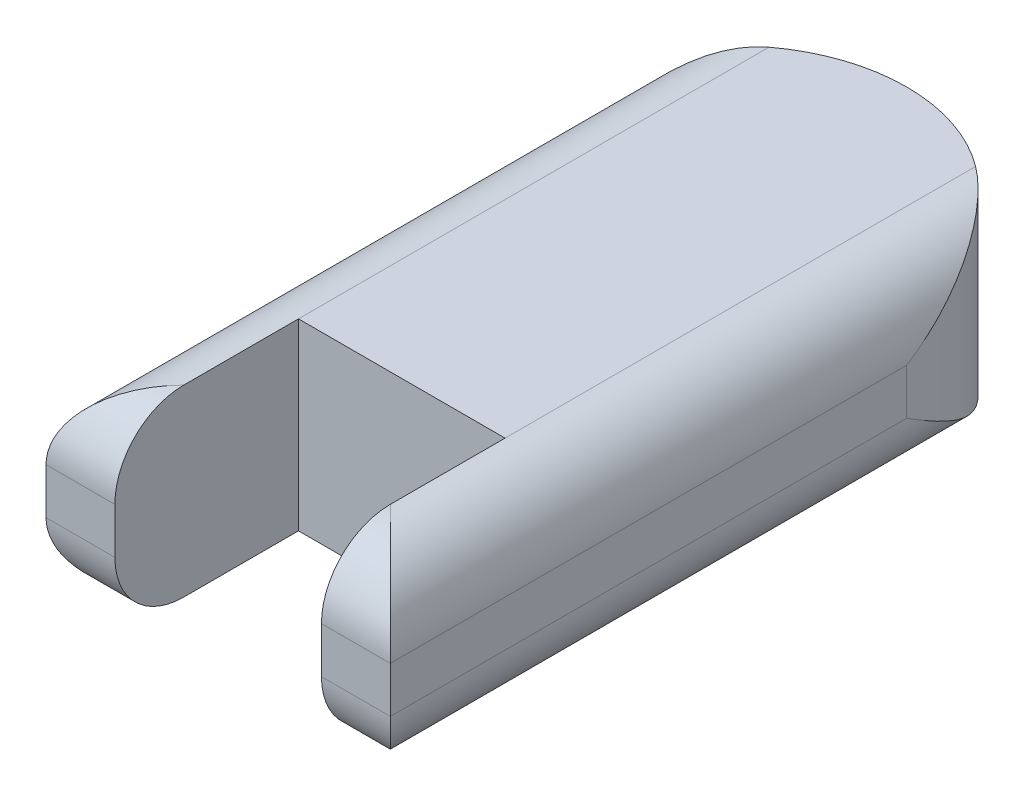
ISO-10303-21;
HEADER;
FILE_DESCRIPTION(('STEP AP214'),'2;1');
FILE_NAME('part.step','',(''),(''),'','','');
FILE_SCHEMA(('AUTOMOTIVE_DESIGN { 1 0 10303 214 1 1 1 1 }'));
ENDSEC;
DATA;
#1=APPLICATION_CONTEXT('core data for automotive mechanical design processes');
#2=APPLICATION_PROTOCOL_DEFINITION('international standard','automotive_design',2000,#1);
#3=PRODUCT_CONTEXT('',#1,'mechanical');
#4=PRODUCT('Part','Part','',(#3));
#5=PRODUCT_RELATED_PRODUCT_CATEGORY('part','',(#4));
#6=PRODUCT_DEFINITION_FORMATION('','',#4);
#7=PRODUCT_DEFINITION_CONTEXT('part definition',#1,'design');
#8=PRODUCT_DEFINITION('design','',#6,#7);
#9=PRODUCT_DEFINITION_SHAPE('','',#8);
#10=(LENGTH_UNIT() NAMED_UNIT(*) SI_UNIT(.MILLI.,.METRE.));
#11=(NAMED_UNIT(*) PLANE_ANGLE_UNIT() SI_UNIT($,.RADIAN.));
#12=(NAMED_UNIT(*) SI_UNIT($,.STERADIAN.) SOLID_ANGLE_UNIT());
#13=UNCERTAINTY_MEASURE_WITH_UNIT(LENGTH_MEASURE(1.E-05),#10,'distance_accuracy_value','');
#14=(GEOMETRIC_REPRESENTATION_CONTEXT(3) GLOBAL_UNCERTAINTY_ASSIGNED_CONTEXT((#13)) GLOBAL_UNIT_ASSIGNED_CONTEXT((#10,
#11,#12)) REPRESENTATION_CONTEXT('',''));
#15=CARTESIAN_POINT('',(0.,0.,0.));
#16=DIRECTION('',(0.,0.,1.));
#17=DIRECTION('',(1.,0.,0.));
#18=AXIS2_PLACEMENT_3D('',#15,#16,#17);
#19=CARTESIAN_POINT('',(-45.,10.,-150.));
#20=DIRECTION('',(0.,0.,1.));
#21=DIRECTION('',(1.,0.,0.));
#22=AXIS2_PLACEMENT_3D('',#19,#20,#21);
#23=CYLINDRICAL_SURFACE('',#22,30.);
#24=DIRECTION('',(0.,0.,1.));
#25=VECTOR('',#24,1.);
#26=CARTESIAN_POINT('',(-45.,40.,-150.));
#27=LINE('',#26,#25);
#28=CARTESIAN_POINT('',(-45.,40.,-135.));
#29=VERTEX_POINT('',#28);
#30=CARTESIAN_POINT('',(-45.,40.,70.));
#31=VERTEX_POINT('',#30);
#32=EDGE_CURVE('E12',#29,#31,#27,.T.);
#33=ORIENTED_EDGE('',*,*,#32,.F.);
#34=CARTESIAN_POINT('',(-45.,40.,-135.));
#35=CARTESIAN_POINT('',(-45.5129326516907,39.999996891138,-134.615322129283));
#36=CARTESIAN_POINT('',(-46.020856524783,39.9868459359491,-134.224081394058));
#37=CARTESIAN_POINT('',(-47.0256414910776,39.9357612324056,-133.429431971806));
#38=CARTESIAN_POINT('',(-47.5225051540346,39.8978333042712,-133.026026163632));
#39=CARTESIAN_POINT('',(-48.5035389933597,39.7987896540022,-132.208512261245));
#40=CARTESIAN_POINT('',(-48.9877291482159,39.737713112406,-131.79442334648));
#41=CARTESIAN_POINT('',(-49.9435913758493,39.5938258336057,-130.955715542044));
#42=CARTESIAN_POINT('',(-50.4152626575976,39.5110137265813,-130.53109599024));
#43=CARTESIAN_POINT('',(-51.8016859134143,39.2338800624589,-129.250869434586));
#44=CARTESIAN_POINT('',(-52.6974316582793,39.0098365048569,-128.380892910171));
#45=CARTESIAN_POINT('',(-54.4350421063243,38.4921490548422,-126.607835373252));
#46=CARTESIAN_POINT('',(-55.2768748642796,38.19846437362,-125.70473522327));
#47=CARTESIAN_POINT('',(-56.6705634529918,37.6439350839685,-124.134612469589));
#48=CARTESIAN_POINT('',(-57.2361608692018,37.3979546830271,-123.474428694605));
#49=CARTESIAN_POINT('',(-58.3389889750294,36.8782989685193,-122.141389758637));
#50=CARTESIAN_POINT('',(-58.8762195091685,36.6046235031806,-121.468534528228));
#51=CARTESIAN_POINT('',(-59.922423392937,36.0322282933504,-120.111389279961));
#52=CARTESIAN_POINT('',(-60.4313908181932,35.7335033308,-119.42709690352));
#53=CARTESIAN_POINT('',(-61.4210781644571,35.1135243081027,-118.048475702944));
#54=CARTESIAN_POINT('',(-61.901798662266,34.7922707082838,-117.354147084111));
#55=CARTESIAN_POINT('',(-63.3072892909294,33.794308017369,-115.249763563041));
#56=CARTESIAN_POINT('',(-64.1896307642946,33.0865981105108,-113.825808096373));
#57=CARTESIAN_POINT('',(-65.8438741364267,31.6047711387151,-110.94910483094));
#58=CARTESIAN_POINT('',(-66.6157739551916,30.8306528235147,-109.496356490491));
#59=CARTESIAN_POINT('',(-67.8421382905647,29.4631851013754,-106.996483241003));
#60=CARTESIAN_POINT('',(-68.3233984919259,28.8832183958558,-105.955049175923));
#61=CARTESIAN_POINT('',(-69.2334515246382,27.7001933711408,-103.862281201929));
#62=CARTESIAN_POINT('',(-69.6622399291931,27.0971331092789,-102.810946465788));
#63=CARTESIAN_POINT('',(-70.4684953636039,25.8711755990845,-100.699585455916));
#64=CARTESIAN_POINT('',(-70.8459405322702,25.2482700393712,-99.6395556823799));
#65=CARTESIAN_POINT('',(-71.5502414414883,23.9859584363945,-97.5126166885381));
#66=CARTESIAN_POINT('',(-71.8770985989791,23.3465528558722,-96.4457076617885));
#67=CARTESIAN_POINT('',(-72.4804787884683,22.0552931936701,-94.308308779173));
#68=CARTESIAN_POINT('',(-72.7571017851753,21.4034667515651,-93.2378304494445));
#69=CARTESIAN_POINT('',(-73.2615322228068,20.0886863253276,-91.0923096966063));
#70=CARTESIAN_POINT('',(-73.4893385656805,19.4257320912552,-90.0172671713869));
#71=CARTESIAN_POINT('',(-74.1002456614274,17.424362182841,-86.7878268803705));
#72=CARTESIAN_POINT('',(-74.4112733763674,16.0724890807064,-84.6275521623039));
#73=CARTESIAN_POINT('',(-74.7511970559847,13.9350877538937,-81.2289210221354));
#74=CARTESIAN_POINT('',(-74.8438863335703,13.1554227009019,-79.9926800811043));
#75=CARTESIAN_POINT('',(-74.9678777696519,11.5935640710989,-77.5196655898393));
#76=CARTESIAN_POINT('',(-74.999222496609,10.8113726252135,-76.2828930050376));
#77=CARTESIAN_POINT('',(-74.9999952377403,10.0195179844808,-75.0308606435064));
#78=CARTESIAN_POINT('',(-74.9999999996146,10.0097589831981,-75.0154303076325));
#79=CARTESIAN_POINT('',(-75.,10.,-75.));
#80=B_SPLINE_CURVE_WITH_KNOTS('',3,(#34,#35,#36,#37,#38,#39,#40,#41,#42,#43,#44,#45,#46,#47,#48,
#49,#50,#51,#52,#53,#54,#55,#56,#57,#58,#59,#60,#61,#62,#63,#64,#65,#66,#67,#68,#69,#70,#71,#72,
#73,#74,#75,#76,#77,#78,#79),.UNSPECIFIED.,.F.,.F.,(4,2,2,2,2,2,2,2,2,2,2,2,2,2,2,2,2,2,2,2,2,2,
4),(0.,1.92316776941375,3.84588394060285,5.76536021797109,7.68495749376332,11.4866856114628,
15.2906459253943,18.0001052576753,20.7095794389195,23.4196194393336,26.1296040815683,
31.5794259047891,37.0293503536748,40.8846323096262,44.7402392935013,48.597482833222,
52.4546183143664,56.3039920103971,60.1534522827089,67.8467408499336,72.2392840195837,
76.6287780154634,76.6835502730769),.UNSPECIFIED.);
#81=CARTESIAN_POINT('',(-75.,10.,-75.));
#82=VERTEX_POINT('',#81);
#83=EDGE_CURVE('E194',#29,#82,#80,.T.);
#84=ORIENTED_EDGE('',*,*,#83,.T.);
#85=DIRECTION('',(0.,0.,1.));
#86=VECTOR('',#85,1.);
#87=CARTESIAN_POINT('',(-75.,10.,-150.));
#88=LINE('',#87,#86);
#89=CARTESIAN_POINT('',(-75.,10.,150.));
#90=VERTEX_POINT('',#89);
#91=EDGE_CURVE('E44',#82,#90,#88,.T.);
#92=ORIENTED_EDGE('',*,*,#91,.T.);
#93=CARTESIAN_POINT('',(-45.,10.,120.));
#94=DIRECTION('',(0.707106781186547,0.,0.707106781186547));
#95=DIRECTION('',(-0.707106781186547,0.,0.707106781186547));
#96=AXIS2_PLACEMENT_3D('',#93,#94,#95);
#97=ELLIPSE('',#96,42.4264068711928,30.);
#98=CARTESIAN_POINT('',(-45.,40.,120.));
#99=VERTEX_POINT('',#98);
#100=EDGE_CURVE('E225',#90,#99,#97,.F.);
#101=ORIENTED_EDGE('',*,*,#100,.T.);
#102=DIRECTION('',(0.,0.,1.));
#103=VECTOR('',#102,1.);
#104=CARTESIAN_POINT('',(-45.,40.,-150.));
#105=LINE('',#104,#103);
#106=EDGE_CURVE('E193',#31,#99,#105,.T.);
#107=ORIENTED_EDGE('',*,*,#106,.F.);
#108=EDGE_LOOP('',(#33,#84,#92,#101,#107));
#109=FACE_BOUND('',#108,.T.);
#110=ADVANCED_FACE('F40',(#109),#23,.T.);
#111=CARTESIAN_POINT('',(-45.,40.,-150.));
#112=DIRECTION('',(0.,1.,0.));
#113=DIRECTION('',(0.,0.,1.));
#114=AXIS2_PLACEMENT_3D('',#111,#112,#113);
#115=PLANE('',#114);
#116=DIRECTION('',(0.,0.,1.));
#117=VECTOR('',#116,1.);
#118=CARTESIAN_POINT('',(45.,40.,-150.));
#119=LINE('',#118,#117);
#120=CARTESIAN_POINT('',(45.,40.,-135.));
#121=VERTEX_POINT('',#120);
#122=CARTESIAN_POINT('',(45.,40.,70.));
#123=VERTEX_POINT('',#122);
#124=EDGE_CURVE('E49',#121,#123,#119,.T.);
#125=ORIENTED_EDGE('',*,*,#124,.F.);
#126=CARTESIAN_POINT('',(0.,40.,-75.));
#127=DIRECTION('',(0.,1.,0.));
#128=DIRECTION('',(0.,0.,-1.));
#129=AXIS2_PLACEMENT_3D('',#126,#127,#128);
#130=CIRCLE('',#129,75.);
#131=EDGE_CURVE('E290',#121,#29,#130,.T.);
#132=ORIENTED_EDGE('',*,*,#131,.T.);
#133=ORIENTED_EDGE('',*,*,#32,.T.);
#134=DIRECTION('',(1.,0.,0.));
#135=VECTOR('',#134,1.);
#136=CARTESIAN_POINT('',(-44.9999999999998,40.,70.));
#137=LINE('',#136,#135);
#138=EDGE_CURVE('E200',#31,#123,#137,.T.);
#139=ORIENTED_EDGE('',*,*,#138,.T.);
#140=EDGE_LOOP('',(#125,#132,#133,#139));
#141=FACE_BOUND('',#140,.T.);
#142=ADVANCED_FACE('F207',(#141),#115,.T.);
#143=CARTESIAN_POINT('',(45.,10.,-150.));
#144=DIRECTION('',(0.,0.,1.));
#145=DIRECTION('',(1.,0.,0.));
#146=AXIS2_PLACEMENT_3D('',#143,#144,#145);
#147=CYLINDRICAL_SURFACE('',#146,30.);
#148=DIRECTION('',(0.,0.,1.));
#149=VECTOR('',#148,1.);
#150=CARTESIAN_POINT('',(75.,10.,-150.));
#151=LINE('',#150,#149);
#152=CARTESIAN_POINT('',(75.,10.,-75.));
#153=VERTEX_POINT('',#152);
#154=CARTESIAN_POINT('',(75.,10.,150.));
#155=VERTEX_POINT('',#154);
#156=EDGE_CURVE('E150',#153,#155,#151,.T.);
#157=ORIENTED_EDGE('',*,*,#156,.F.);
#158=CARTESIAN_POINT('',(45.,40.,-135.));
#159=CARTESIAN_POINT('',(45.5129326516886,39.999996891138,-134.615322129284));
#160=CARTESIAN_POINT('',(46.0208565247789,39.9868459359492,-134.224081394061));
#161=CARTESIAN_POINT('',(47.0256414910695,39.9357612324061,-133.429431971813));
#162=CARTESIAN_POINT('',(47.5225051540246,39.897833304272,-133.02602616364));
#163=CARTESIAN_POINT('',(48.5035389933459,39.7987896540038,-132.208512261257));
#164=CARTESIAN_POINT('',(48.9877291482002,39.7377131124081,-131.794423346493));
#165=CARTESIAN_POINT('',(49.9435913758301,39.5938258336089,-130.955715542061));
#166=CARTESIAN_POINT('',(50.4152626575767,39.5110137265852,-130.531095990259));
#167=CARTESIAN_POINT('',(51.8016859133959,39.2338800624633,-129.250869434603));
#168=CARTESIAN_POINT('',(52.6974316582649,39.0098365048608,-128.380892910186));
#169=CARTESIAN_POINT('',(54.4350421063175,38.4921490548446,-126.60783537326));
#170=CARTESIAN_POINT('',(55.2768748642764,38.1984643736213,-125.704735223274));
#171=CARTESIAN_POINT('',(56.6705634529931,37.643935083968,-124.134612469587));
#172=CARTESIAN_POINT('',(57.2361608692044,37.3979546830261,-123.474428694602));
#173=CARTESIAN_POINT('',(58.3389889750343,36.8782989685169,-122.141389758631));
#174=CARTESIAN_POINT('',(58.8762195091745,36.6046235031775,-121.46853452822));
#175=CARTESIAN_POINT('',(59.9224233929451,36.0322282933458,-120.11138927995));
#176=CARTESIAN_POINT('',(60.4313908182024,35.7335033307946,-119.427096903507));
#177=CARTESIAN_POINT('',(61.4210781644681,35.1135243080955,-118.048475702929));
#178=CARTESIAN_POINT('',(61.901798662278,34.7922707082758,-117.354147084094));
#179=CARTESIAN_POINT('',(63.3072892909396,33.7943080173611,-115.249763563025));
#180=CARTESIAN_POINT('',(64.1896307643025,33.0865981105041,-113.82580809636));
#181=CARTESIAN_POINT('',(65.8438741364303,31.6047711387115,-110.949104830933));
#182=CARTESIAN_POINT('',(66.6157739551933,30.8306528235128,-109.496356490488));
#183=CARTESIAN_POINT('',(67.8421382905638,29.4631851013765,-106.996483241004));
#184=CARTESIAN_POINT('',(68.3233984919241,28.8832183958579,-105.955049175927));
#185=CARTESIAN_POINT('',(69.233451524635,27.7001933711451,-103.862281201936));
#186=CARTESIAN_POINT('',(69.6622399291892,27.0971331092844,-102.810946465798));
#187=CARTESIAN_POINT('',(70.4684953635992,25.8711755990922,-100.699585455929));
#188=CARTESIAN_POINT('',(70.8459405322652,25.2482700393799,-99.6395556823941));
#189=CARTESIAN_POINT('',(71.5502414414828,23.9859584364047,-97.5126166885556));
#190=CARTESIAN_POINT('',(71.8770985989734,23.3465528558827,-96.445707661808));
#191=CARTESIAN_POINT('',(72.4804787884634,22.0552931936824,-94.308308779191));
#192=CARTESIAN_POINT('',(72.7571017851711,21.4034667515786,-93.2378304494593));
#193=CARTESIAN_POINT('',(73.261532222804,20.0886863253325,-91.0923096966212));
#194=CARTESIAN_POINT('',(73.4893385656784,19.4257320912502,-90.0172671714053));
#195=CARTESIAN_POINT('',(74.1002456614265,17.4243621828687,-86.7878268803613));
#196=CARTESIAN_POINT('',(74.411273376367,16.0724890808381,-84.6275521622246));
#197=CARTESIAN_POINT('',(74.7511970559848,13.9350877538197,-81.2289210221818));
#198=CARTESIAN_POINT('',(74.8438863335705,13.155422700677,-79.9926800812459));
#199=CARTESIAN_POINT('',(74.9678777696517,11.5935640713239,-77.5196655896964));
#200=CARTESIAN_POINT('',(74.9992224966083,10.8113726260387,-76.2828930045154));
#201=CARTESIAN_POINT('',(74.9999952377403,10.0195179845012,-75.0308606434934));
#202=CARTESIAN_POINT('',(74.9999999996146,10.0097589832084,-75.0154303076259));
#203=CARTESIAN_POINT('',(75.,10.,-75.));
#204=B_SPLINE_CURVE_WITH_KNOTS('',3,(#158,#159,#160,#161,#162,#163,#164,#165,#166,#167,#168,
#169,#170,#171,#172,#173,#174,#175,#176,#177,#178,#179,#180,#181,#182,#183,#184,#185,#186,#187,
#188,#189,#190,#191,#192,#193,#194,#195,#196,#197,#198,#199,#200,#201,#202,#203),.UNSPECIFIED.,
.F.,.F.,(4,2,2,2,2,2,2,2,2,2,2,2,2,2,2,2,2,2,2,2,2,2,4),(0.,1.92316776940592,3.84588394058717,
5.76536021794771,7.68495749373223,11.4866856114473,15.2906459253943,18.0001052576813,
20.7095794389316,23.419619439352,26.129604081593,31.5794259048021,37.0293503536748,
40.8846323096192,44.7402392934873,48.5974828332028,52.4546183143417,56.3039920103792,
60.1534522826983,67.8467408499337,72.2392840195843,76.6287780154634,76.6835502730768),.UNSPECIFIED.);
#205=EDGE_CURVE('E135',#153,#121,#204,.F.);
#206=ORIENTED_EDGE('',*,*,#205,.T.);
#207=ORIENTED_EDGE('',*,*,#124,.T.);
#208=DIRECTION('',(0.,0.,1.));
#209=VECTOR('',#208,1.);
#210=CARTESIAN_POINT('',(45.,40.,-150.));
#211=LINE('',#210,#209);
#212=CARTESIAN_POINT('',(45.,40.,120.));
#213=VERTEX_POINT('',#212);
#214=EDGE_CURVE('E181',#123,#213,#211,.T.);
#215=ORIENTED_EDGE('',*,*,#214,.T.);
#216=CARTESIAN_POINT('',(45.,10.,120.));
#217=DIRECTION('',(-0.707106781186547,0.,0.707106781186547));
#218=DIRECTION('',(0.707106781186547,0.,0.707106781186547));
#219=AXIS2_PLACEMENT_3D('',#216,#217,#218);
#220=ELLIPSE('',#219,42.4264068711928,30.);
#221=EDGE_CURVE('E219',#213,#155,#220,.F.);
#222=ORIENTED_EDGE('',*,*,#221,.T.);
#223=EDGE_LOOP('',(#157,#206,#207,#215,#222));
#224=FACE_BOUND('',#223,.T.);
#225=ADVANCED_FACE('F179',(#224),#147,.T.);
#226=CARTESIAN_POINT('',(45.,-10.,-150.));
#227=DIRECTION('',(0.,0.,1.));
#228=DIRECTION('',(1.,0.,0.));
#229=AXIS2_PLACEMENT_3D('',#226,#227,#228);
#230=CYLINDRICAL_SURFACE('',#229,30.);
#231=DIRECTION('',(0.,0.,1.));
#232=VECTOR('',#231,1.);
#233=CARTESIAN_POINT('',(45.,-40.,-150.));
#234=LINE('',#233,#232);
#235=CARTESIAN_POINT('',(45.,-40.,-135.));
#236=VERTEX_POINT('',#235);
#237=CARTESIAN_POINT('',(45.,-40.,70.));
#238=VERTEX_POINT('',#237);
#239=EDGE_CURVE('E144',#236,#238,#234,.T.);
#240=ORIENTED_EDGE('',*,*,#239,.F.);
#241=CARTESIAN_POINT('',(45.,-40.,-135.));
#242=CARTESIAN_POINT('',(45.5129326516883,-39.999996891138,-134.615322129285));
#243=CARTESIAN_POINT('',(46.0208565247782,-39.9868459359492,-134.224081394061));
#244=CARTESIAN_POINT('',(47.0256414910682,-39.9357612324062,-133.429431971814));
#245=CARTESIAN_POINT('',(47.522505154023,-39.8978333042722,-133.026026163641));
#246=CARTESIAN_POINT('',(48.5035389933438,-39.798789654004,-132.208512261259));
#247=CARTESIAN_POINT('',(48.9877291481979,-39.7377131124084,-131.794423346495));
#248=CARTESIAN_POINT('',(49.9435913758272,-39.5938258336094,-130.955715542064));
#249=CARTESIAN_POINT('',(50.4152626575735,-39.5110137265857,-130.531095990262));
#250=CARTESIAN_POINT('',(51.8016859133932,-39.233880062464,-129.250869434606));
#251=CARTESIAN_POINT('',(52.6974316582627,-39.0098365048614,-128.380892910188));
#252=CARTESIAN_POINT('',(54.4350421063165,-38.492149054845,-126.607835373261));
#253=CARTESIAN_POINT('',(55.2768748642758,-38.1984643736215,-125.704735223275));
#254=CARTESIAN_POINT('',(56.6705634529933,-37.6439350839679,-124.134612469587));
#255=CARTESIAN_POINT('',(57.2361608692047,-37.3979546830259,-123.474428694601));
#256=CARTESIAN_POINT('',(58.338988975035,-36.8782989685166,-122.14138975863));
#257=CARTESIAN_POINT('',(58.8762195091754,-36.6046235031771,-121.468534528219));
#258=CARTESIAN_POINT('',(59.9224233929463,-36.0322282933451,-120.111389279948));
#259=CARTESIAN_POINT('',(60.4313908182037,-35.7335033307938,-119.427096903505));
#260=CARTESIAN_POINT('',(61.4210781644698,-35.1135243080944,-118.048475702926));
#261=CARTESIAN_POINT('',(61.9017986622797,-34.7922707082745,-117.354147084091));
#262=CARTESIAN_POINT('',(63.3072892909411,-33.7943080173598,-115.249763563023));
#263=CARTESIAN_POINT('',(64.1896307643037,-33.086598110503,-113.825808096358));
#264=CARTESIAN_POINT('',(65.8438741364309,-31.6047711387109,-110.949104830932));
#265=CARTESIAN_POINT('',(66.6157739551936,-30.8306528235125,-109.496356490487));
#266=CARTESIAN_POINT('',(67.8421382905636,-29.4631851013766,-106.996483241005));
#267=CARTESIAN_POINT('',(68.3233984919238,-28.8832183958583,-105.955049175927));
#268=CARTESIAN_POINT('',(69.2334515246345,-27.7001933711458,-103.862281201937));
#269=CARTESIAN_POINT('',(69.6622399291886,-27.0971331092853,-102.810946465799));
#270=CARTESIAN_POINT('',(70.4684953635984,-25.8711755990934,-100.699585455931));
#271=CARTESIAN_POINT('',(70.8459405322644,-25.2482700393813,-99.6395556823963));
#272=CARTESIAN_POINT('',(71.5502414414819,-23.9859584364063,-97.5126166885583));
#273=CARTESIAN_POINT('',(71.8770985989725,-23.3465528558844,-96.445707661811));
#274=CARTESIAN_POINT('',(72.4804787884626,-22.0552931936842,-94.3083087791939));
#275=CARTESIAN_POINT('',(72.7571017851705,-21.4034667515807,-93.2378304494616));
#276=CARTESIAN_POINT('',(73.2615322228035,-20.0886863253333,-91.0923096966235));
#277=CARTESIAN_POINT('',(73.489338565678,-19.4257320912495,-90.0172671714081));
#278=CARTESIAN_POINT('',(74.1002456614264,-17.4243621828727,-86.78782688036));
#279=CARTESIAN_POINT('',(74.411273376367,-16.0724890808575,-84.627552162213));
#280=CARTESIAN_POINT('',(74.7511970559848,-13.9350877538087,-81.2289210221887));
#281=CARTESIAN_POINT('',(74.8438863335704,-13.1554227006437,-79.9926800812669));
#282=CARTESIAN_POINT('',(74.9678777696518,-11.5935640713573,-77.5196655896753));
#283=CARTESIAN_POINT('',(74.9992224966087,-10.811372626161,-76.282893004438));
#284=CARTESIAN_POINT('',(74.9999952377403,-10.0195179845043,-75.0308606434915));
#285=CARTESIAN_POINT('',(74.9999999996146,-10.00975898321,-75.015430307625));
#286=CARTESIAN_POINT('',(75.,-10.,-75.));
#287=B_SPLINE_CURVE_WITH_KNOTS('',3,(#241,#242,#243,#244,#245,#246,#247,#248,#249,#250,#251,
#252,#253,#254,#255,#256,#257,#258,#259,#260,#261,#262,#263,#264,#265,#266,#267,#268,#269,#270,
#271,#272,#273,#274,#275,#276,#277,#278,#279,#280,#281,#282,#283,#284,#285,#286),.UNSPECIFIED.,
.F.,.F.,(4,2,2,2,2,2,2,2,2,2,2,2,2,2,2,2,2,2,2,2,2,2,4),(0.,1.92316776940472,3.84588394058478,
5.76536021794419,7.68495749372755,11.486685611445,15.2906459253942,18.0001052576822,
20.7095794389334,23.4196194393547,26.1296040815966,31.579425904804,37.0293503536747,
40.884632309618,44.7402392934851,48.5974828331998,52.4546183143379,56.3039920103763,
60.1534522826966,67.8467408499337,72.2392840195844,76.6287780154633,76.6835502730768),.UNSPECIFIED.);
#288=CARTESIAN_POINT('',(75.,-10.,-75.));
#289=VERTEX_POINT('',#288);
#290=EDGE_CURVE('E132',#236,#289,#287,.T.);
#291=ORIENTED_EDGE('',*,*,#290,.T.);
#292=DIRECTION('',(0.,0.,1.));
#293=VECTOR('',#292,1.);
#294=CARTESIAN_POINT('',(75.,-10.,-150.));
#295=LINE('',#294,#293);
#296=CARTESIAN_POINT('',(75.,-10.,150.));
#297=VERTEX_POINT('',#296);
#298=EDGE_CURVE('E65',#289,#297,#295,.T.);
#299=ORIENTED_EDGE('',*,*,#298,.T.);
#300=CARTESIAN_POINT('',(45.,-9.99999999999999,120.));
#301=DIRECTION('',(-0.707106781186547,0.,0.707106781186547));
#302=DIRECTION('',(0.707106781186547,0.,0.707106781186547));
#303=AXIS2_PLACEMENT_3D('',#300,#301,#302);
#304=ELLIPSE('',#303,42.4264068711928,30.);
#305=CARTESIAN_POINT('',(45.,-40.,120.));
#306=VERTEX_POINT('',#305);
#307=EDGE_CURVE('E172',#297,#306,#304,.F.);
#308=ORIENTED_EDGE('',*,*,#307,.T.);
#309=DIRECTION('',(0.,0.,1.));
#310=VECTOR('',#309,1.);
#311=CARTESIAN_POINT('',(45.,-40.,150.));
#312=LINE('',#311,#310);
#313=EDGE_CURVE('E230',#238,#306,#312,.T.);
#314=ORIENTED_EDGE('',*,*,#313,.F.);
#315=EDGE_LOOP('',(#240,#291,#299,#308,#314));
#316=FACE_BOUND('',#315,.T.);
#317=ADVANCED_FACE('F142',(#316),#230,.T.);
#318=CARTESIAN_POINT('',(-45.,-10.,-150.));
#319=DIRECTION('',(0.,0.,1.));
#320=DIRECTION('',(1.,0.,0.));
#321=AXIS2_PLACEMENT_3D('',#318,#319,#320);
#322=CYLINDRICAL_SURFACE('',#321,30.);
#323=DIRECTION('',(0.,0.,1.));
#324=VECTOR('',#323,1.);
#325=CARTESIAN_POINT('',(-75.,-10.,-150.));
#326=LINE('',#325,#324);
#327=CARTESIAN_POINT('',(-75.,-10.,-75.));
#328=VERTEX_POINT('',#327);
#329=CARTESIAN_POINT('',(-75.,-9.99999999999999,150.));
#330=VERTEX_POINT('',#329);
#331=EDGE_CURVE('E157',#328,#330,#326,.T.);
#332=ORIENTED_EDGE('',*,*,#331,.F.);
#333=CARTESIAN_POINT('',(-45.,-40.,-135.));
#334=CARTESIAN_POINT('',(-45.5129326516913,-39.999996891138,-134.615322129282));
#335=CARTESIAN_POINT('',(-46.0208565247843,-39.9868459359491,-134.224081394057));
#336=CARTESIAN_POINT('',(-47.0256414910802,-39.9357612324054,-133.429431971804));
#337=CARTESIAN_POINT('',(-47.5225051540378,-39.897833304271,-133.026026163629));
#338=CARTESIAN_POINT('',(-48.5035389933641,-39.7987896540017,-132.208512261241));
#339=CARTESIAN_POINT('',(-48.9877291482209,-39.7377131124053,-131.794423346475));
#340=CARTESIAN_POINT('',(-49.9435913758554,-39.5938258336047,-130.955715542039));
#341=CARTESIAN_POINT('',(-50.4152626576042,-39.5110137265801,-130.531095990234));
#342=CARTESIAN_POINT('',(-51.8016859134201,-39.2338800624575,-129.25086943458));
#343=CARTESIAN_POINT('',(-52.6974316582838,-39.0098365048556,-128.380892910167));
#344=CARTESIAN_POINT('',(-54.4350421063265,-38.4921490548415,-126.60783537325));
#345=CARTESIAN_POINT('',(-55.2768748642807,-38.1984643736196,-125.704735223269));
#346=CARTESIAN_POINT('',(-56.6705634529914,-37.6439350839687,-124.134612469589));
#347=CARTESIAN_POINT('',(-57.236160869201,-37.3979546830275,-123.474428694606));
#348=CARTESIAN_POINT('',(-58.3389889750279,-36.87829896852,-122.141389758639));
#349=CARTESIAN_POINT('',(-58.8762195091666,-36.6046235031815,-121.46853452823));
#350=CARTESIAN_POINT('',(-59.9224233929344,-36.0322282933518,-120.111389279964));
#351=CARTESIAN_POINT('',(-60.4313908181904,-35.7335033308017,-119.427096903523));
#352=CARTESIAN_POINT('',(-61.4210781644536,-35.113524308105,-118.048475702949));
#353=CARTESIAN_POINT('',(-61.9017986622623,-34.7922707082864,-117.354147084117));
#354=CARTESIAN_POINT('',(-63.3072892909261,-33.7943080173715,-115.249763563046));
#355=CARTESIAN_POINT('',(-64.1896307642921,-33.0865981105129,-113.825808096377));
#356=CARTESIAN_POINT('',(-65.8438741364255,-31.6047711387163,-110.949104830942));
#357=CARTESIAN_POINT('',(-66.6157739551911,-30.8306528235153,-109.496356490492));
#358=CARTESIAN_POINT('',(-67.842138290565,-29.4631851013751,-106.996483241002));
#359=CARTESIAN_POINT('',(-68.3233984919264,-28.8832183958551,-105.955049175922));
#360=CARTESIAN_POINT('',(-69.2334515246392,-27.7001933711394,-103.862281201926));
#361=CARTESIAN_POINT('',(-69.6622399291943,-27.0971331092772,-102.810946465785));
#362=CARTESIAN_POINT('',(-70.4684953636054,-25.8711755990821,-100.699585455912));
#363=CARTESIAN_POINT('',(-70.8459405322718,-25.2482700393684,-99.6395556823754));
#364=CARTESIAN_POINT('',(-71.55024144149,-23.9859584363913,-97.5126166885326));
#365=CARTESIAN_POINT('',(-71.8770985989808,-23.3465528558688,-96.4457076617824));
#366=CARTESIAN_POINT('',(-72.4804787884699,-22.0552931936662,-94.3083087791673));
#367=CARTESIAN_POINT('',(-72.7571017851766,-21.4034667515608,-93.2378304494399));
#368=CARTESIAN_POINT('',(-73.2615322228077,-20.0886863253261,-91.0923096966016));
#369=CARTESIAN_POINT('',(-73.4893385656812,-19.4257320912569,-90.0172671713811));
#370=CARTESIAN_POINT('',(-74.1002456614277,-17.4243621828323,-86.7878268803735));
#371=CARTESIAN_POINT('',(-74.4112733763675,-16.0724890806645,-84.6275521623292));
#372=CARTESIAN_POINT('',(-74.7511970559847,-13.9350877539172,-81.2289210221207));
#373=CARTESIAN_POINT('',(-74.8438863335702,-13.1554227009735,-79.9926800810592));
#374=CARTESIAN_POINT('',(-74.967877769652,-11.5935640710275,-77.5196655898846));
#375=CARTESIAN_POINT('',(-74.9992224966094,-10.8113726249513,-76.2828930052035));
#376=CARTESIAN_POINT('',(-74.9999952377403,-10.0195179844742,-75.0308606435105));
#377=CARTESIAN_POINT('',(-74.9999999996146,-10.0097589831948,-75.0154303076345));
#378=CARTESIAN_POINT('',(-75.,-10.,-75.));
#379=B_SPLINE_CURVE_WITH_KNOTS('',3,(#333,#334,#335,#336,#337,#338,#339,#340,#341,#342,#343,
#344,#345,#346,#347,#348,#349,#350,#351,#352,#353,#354,#355,#356,#357,#358,#359,#360,#361,#362,
#363,#364,#365,#366,#367,#368,#369,#370,#371,#372,#373,#374,#375,#376,#377,#378),.UNSPECIFIED.,
.F.,.F.,(4,2,2,2,2,2,2,2,2,2,2,2,2,2,2,2,2,2,2,2,2,2,4),(0.,1.92316776941624,3.84588394060782,
5.76536021797852,7.68495749377315,11.4866856114677,15.2906459253943,18.0001052576734,
20.7095794389157,23.4196194393278,26.1296040815605,31.579425904785,37.0293503536747,
40.8846323096284,44.7402392935057,48.597482833228,52.4546183143741,56.3039920104027,
60.1534522827122,67.8467408499334,72.2392840195835,76.6287780154634,76.6835502730769),.UNSPECIFIED.);
#380=CARTESIAN_POINT('',(-45.,-40.,-135.));
#381=VERTEX_POINT('',#380);
#382=EDGE_CURVE('E57',#328,#381,#379,.F.);
#383=ORIENTED_EDGE('',*,*,#382,.T.);
#384=DIRECTION('',(0.,0.,1.));
#385=VECTOR('',#384,1.);
#386=CARTESIAN_POINT('',(-45.,-40.,-150.));
#387=LINE('',#386,#385);
#388=CARTESIAN_POINT('',(-44.9999999999998,-40.,70.));
#389=VERTEX_POINT('',#388);
#390=EDGE_CURVE('E153',#381,#389,#387,.T.);
#391=ORIENTED_EDGE('',*,*,#390,.T.);
#392=DIRECTION('',(0.,0.,-1.));
#393=VECTOR('',#392,1.);
#394=CARTESIAN_POINT('',(-44.9999999999998,-40.,150.));
#395=LINE('',#394,#393);
#396=CARTESIAN_POINT('',(-44.9999999999998,-40.,120.));
#397=VERTEX_POINT('',#396);
#398=EDGE_CURVE('E246',#397,#389,#395,.T.);
#399=ORIENTED_EDGE('',*,*,#398,.F.);
#400=CARTESIAN_POINT('',(-45.,-9.99999999999999,120.));
#401=DIRECTION('',(0.707106781186547,0.,0.707106781186547));
#402=DIRECTION('',(-0.707106781186547,0.,0.707106781186547));
#403=AXIS2_PLACEMENT_3D('',#400,#401,#402);
#404=ELLIPSE('',#403,42.4264068711928,30.);
#405=EDGE_CURVE('E227',#397,#330,#404,.F.);
#406=ORIENTED_EDGE('',*,*,#405,.T.);
#407=EDGE_LOOP('',(#332,#383,#391,#399,#406));
#408=FACE_BOUND('',#407,.T.);
#409=ADVANCED_FACE('F283',(#408),#322,.T.);
#410=CARTESIAN_POINT('',(75.,-10.,-150.));
#411=DIRECTION('',(1.,0.,0.));
#412=DIRECTION('',(0.,0.,-1.));
#413=AXIS2_PLACEMENT_3D('',#410,#411,#412);
#414=PLANE('',#413);
#415=ORIENTED_EDGE('',*,*,#298,.F.);
#416=DIRECTION('',(0.,1.,0.));
#417=VECTOR('',#416,1.);
#418=CARTESIAN_POINT('',(75.,-40.,-75.));
#419=LINE('',#418,#417);
#420=EDGE_CURVE('E130',#289,#153,#419,.T.);
#421=ORIENTED_EDGE('',*,*,#420,.T.);
#422=ORIENTED_EDGE('',*,*,#156,.T.);
#423=DIRECTION('',(0.,1.,0.));
#424=VECTOR('',#423,1.);
#425=CARTESIAN_POINT('',(75.,-10.,150.));
#426=LINE('',#425,#424);
#427=EDGE_CURVE('E149',#297,#155,#426,.T.);
#428=ORIENTED_EDGE('',*,*,#427,.F.);
#429=EDGE_LOOP('',(#415,#421,#422,#428));
#430=FACE_BOUND('',#429,.T.);
#431=ADVANCED_FACE('F147',(#430),#414,.T.);
#432=CARTESIAN_POINT('',(-45.,-40.,-150.));
#433=DIRECTION('',(0.,-1.,0.));
#434=DIRECTION('',(0.,0.,-1.));
#435=AXIS2_PLACEMENT_3D('',#432,#433,#434);
#436=PLANE('',#435);
#437=ORIENTED_EDGE('',*,*,#390,.F.);
#438=CARTESIAN_POINT('',(0.,-40.,-75.));
#439=DIRECTION('',(0.,1.,0.));
#440=DIRECTION('',(0.,0.,-1.));
#441=AXIS2_PLACEMENT_3D('',#438,#439,#440);
#442=CIRCLE('',#441,75.);
#443=EDGE_CURVE('E139',#236,#381,#442,.T.);
#444=ORIENTED_EDGE('',*,*,#443,.F.);
#445=ORIENTED_EDGE('',*,*,#239,.T.);
#446=DIRECTION('',(1.,0.,0.));
#447=VECTOR('',#446,1.);
#448=CARTESIAN_POINT('',(-44.9999999999998,-40.,70.));
#449=LINE('',#448,#447);
#450=EDGE_CURVE('E203',#389,#238,#449,.T.);
#451=ORIENTED_EDGE('',*,*,#450,.F.);
#452=EDGE_LOOP('',(#437,#444,#445,#451));
#453=FACE_BOUND('',#452,.T.);
#454=ADVANCED_FACE('F289',(#453),#436,.T.);
#455=CARTESIAN_POINT('',(-45.,10.,150.));
#456=DIRECTION('',(0.,0.,-1.));
#457=DIRECTION('',(-1.,0.,0.));
#458=AXIS2_PLACEMENT_3D('',#455,#456,#457);
#459=PLANE('',#458);
#460=DIRECTION('',(1.,0.,0.));
#461=VECTOR('',#460,1.);
#462=CARTESIAN_POINT('',(-75.,-9.99999999999999,150.));
#463=LINE('',#462,#461);
#464=CARTESIAN_POINT('',(-44.9999999999998,-9.99999999999999,150.));
#465=VERTEX_POINT('',#464);
#466=EDGE_CURVE('E216',#330,#465,#463,.T.);
#467=ORIENTED_EDGE('',*,*,#466,.T.);
#468=DIRECTION('',(0.,-1.,0.));
#469=VECTOR('',#468,1.);
#470=CARTESIAN_POINT('',(-44.9999999999998,40.001,150.));
#471=LINE('',#470,#469);
#472=CARTESIAN_POINT('',(-44.9999999999998,10.,150.));
#473=VERTEX_POINT('',#472);
#474=EDGE_CURVE('E209',#473,#465,#471,.T.);
#475=ORIENTED_EDGE('',*,*,#474,.F.);
#476=DIRECTION('',(1.,0.,0.));
#477=VECTOR('',#476,1.);
#478=CARTESIAN_POINT('',(-75.,10.,150.));
#479=LINE('',#478,#477);
#480=EDGE_CURVE('E221',#90,#473,#479,.T.);
#481=ORIENTED_EDGE('',*,*,#480,.F.);
#482=DIRECTION('',(0.,-1.,0.));
#483=VECTOR('',#482,1.);
#484=CARTESIAN_POINT('',(-75.,-10.,150.));
#485=LINE('',#484,#483);
#486=EDGE_CURVE('E167',#90,#330,#485,.T.);
#487=ORIENTED_EDGE('',*,*,#486,.T.);
#488=EDGE_LOOP('',(#467,#475,#481,#487));
#489=FACE_BOUND('',#488,.T.);
#490=ADVANCED_FACE('F268',(#489),#459,.F.);
#491=CARTESIAN_POINT('',(-75.,9.99999999999999,120.));
#492=DIRECTION('',(1.,0.,0.));
#493=DIRECTION('',(0.,0.,-1.));
#494=AXIS2_PLACEMENT_3D('',#491,#492,#493);
#495=CYLINDRICAL_SURFACE('',#494,30.);
#496=CARTESIAN_POINT('',(-44.9999999999998,9.99999999999999,120.));
#497=DIRECTION('',(-1.,0.,0.));
#498=DIRECTION('',(0.,0.,1.));
#499=AXIS2_PLACEMENT_3D('',#496,#497,#498);
#500=CIRCLE('',#499,30.);
#501=EDGE_CURVE('E240',#473,#99,#500,.T.);
#502=ORIENTED_EDGE('',*,*,#501,.T.);
#503=ORIENTED_EDGE('',*,*,#100,.F.);
#504=ORIENTED_EDGE('',*,*,#480,.T.);
#505=EDGE_LOOP('',(#502,#503,#504));
#506=FACE_BOUND('',#505,.T.);
#507=ADVANCED_FACE('F258',(#506),#495,.T.);
#508=CARTESIAN_POINT('',(-75.,-9.99999999999999,120.));
#509=DIRECTION('',(1.,0.,0.));
#510=DIRECTION('',(0.,0.,-1.));
#511=AXIS2_PLACEMENT_3D('',#508,#509,#510);
#512=CYLINDRICAL_SURFACE('',#511,30.);
#513=CARTESIAN_POINT('',(-44.9999999999998,-9.99999999999999,120.));
#514=DIRECTION('',(-1.,0.,0.));
#515=DIRECTION('',(0.,0.,1.));
#516=AXIS2_PLACEMENT_3D('',#513,#514,#515);
#517=CIRCLE('',#516,30.);
#518=EDGE_CURVE('E237',#397,#465,#517,.T.);
#519=ORIENTED_EDGE('',*,*,#518,.T.);
#520=ORIENTED_EDGE('',*,*,#466,.F.);
#521=ORIENTED_EDGE('',*,*,#405,.F.);
#522=EDGE_LOOP('',(#519,#520,#521));
#523=FACE_BOUND('',#522,.T.);
#524=ADVANCED_FACE('F265',(#523),#512,.T.);
#525=CARTESIAN_POINT('',(45.,10.,150.));
#526=VERTEX_POINT('',#525);
#527=EDGE_CURVE('E211',#526,#155,#479,.T.);
#528=ORIENTED_EDGE('',*,*,#527,.F.);
#529=DIRECTION('',(0.,-1.,0.));
#530=VECTOR('',#529,1.);
#531=CARTESIAN_POINT('',(45.,40.001,150.));
#532=LINE('',#531,#530);
#533=CARTESIAN_POINT('',(45.,-9.99999999999999,150.));
#534=VERTEX_POINT('',#533);
#535=EDGE_CURVE('E204',#526,#534,#532,.T.);
#536=ORIENTED_EDGE('',*,*,#535,.T.);
#537=EDGE_CURVE('E220',#534,#297,#463,.T.);
#538=ORIENTED_EDGE('',*,*,#537,.T.);
#539=ORIENTED_EDGE('',*,*,#427,.T.);
#540=EDGE_LOOP('',(#528,#536,#538,#539));
#541=FACE_BOUND('',#540,.T.);
#542=ADVANCED_FACE('F251',(#541),#459,.F.);
#543=CARTESIAN_POINT('',(-75.,-10.,-150.));
#544=DIRECTION('',(-1.,0.,0.));
#545=DIRECTION('',(0.,0.,1.));
#546=AXIS2_PLACEMENT_3D('',#543,#544,#545);
#547=PLANE('',#546);
#548=DIRECTION('',(0.,1.,0.));
#549=VECTOR('',#548,1.);
#550=CARTESIAN_POINT('',(-75.,-40.,-75.));
#551=LINE('',#550,#549);
#552=EDGE_CURVE('E138',#328,#82,#551,.T.);
#553=ORIENTED_EDGE('',*,*,#552,.F.);
#554=ORIENTED_EDGE('',*,*,#331,.T.);
#555=ORIENTED_EDGE('',*,*,#486,.F.);
#556=ORIENTED_EDGE('',*,*,#91,.F.);
#557=EDGE_LOOP('',(#553,#554,#555,#556));
#558=FACE_BOUND('',#557,.T.);
#559=ADVANCED_FACE('F256',(#558),#547,.T.);
#560=CARTESIAN_POINT('',(45.,9.99999999999999,120.));
#561=DIRECTION('',(1.,0.,0.));
#562=DIRECTION('',(0.,0.,-1.));
#563=AXIS2_PLACEMENT_3D('',#560,#561,#562);
#564=CIRCLE('',#563,30.);
#565=EDGE_CURVE('E192',#213,#526,#564,.T.);
#566=ORIENTED_EDGE('',*,*,#565,.T.);
#567=ORIENTED_EDGE('',*,*,#527,.T.);
#568=ORIENTED_EDGE('',*,*,#221,.F.);
#569=EDGE_LOOP('',(#566,#567,#568));
#570=FACE_BOUND('',#569,.T.);
#571=ADVANCED_FACE('F254',(#570),#495,.T.);
#572=CARTESIAN_POINT('',(45.,-9.99999999999999,120.));
#573=DIRECTION('',(1.,0.,0.));
#574=DIRECTION('',(0.,0.,-1.));
#575=AXIS2_PLACEMENT_3D('',#572,#573,#574);
#576=CIRCLE('',#575,30.);
#577=EDGE_CURVE('E235',#534,#306,#576,.T.);
#578=ORIENTED_EDGE('',*,*,#577,.T.);
#579=ORIENTED_EDGE('',*,*,#307,.F.);
#580=ORIENTED_EDGE('',*,*,#537,.F.);
#581=EDGE_LOOP('',(#578,#579,#580));
#582=FACE_BOUND('',#581,.T.);
#583=ADVANCED_FACE('F234',(#582),#512,.T.);
#584=CARTESIAN_POINT('',(-44.9999999999998,40.001,150.));
#585=DIRECTION('',(-1.,0.,0.));
#586=DIRECTION('',(0.,0.,1.));
#587=AXIS2_PLACEMENT_3D('',#584,#585,#586);
#588=PLANE('',#587);
#589=ORIENTED_EDGE('',*,*,#501,.F.);
#590=ORIENTED_EDGE('',*,*,#474,.T.);
#591=ORIENTED_EDGE('',*,*,#518,.F.);
#592=ORIENTED_EDGE('',*,*,#398,.T.);
#593=DIRECTION('',(0.,-1.,0.));
#594=VECTOR('',#593,1.);
#595=CARTESIAN_POINT('',(-44.9999999999998,40.001,70.));
#596=LINE('',#595,#594);
#597=EDGE_CURVE('E205',#31,#389,#596,.T.);
#598=ORIENTED_EDGE('',*,*,#597,.F.);
#599=ORIENTED_EDGE('',*,*,#106,.T.);
#600=EDGE_LOOP('',(#589,#590,#591,#592,#598,#599));
#601=FACE_BOUND('',#600,.T.);
#602=ADVANCED_FACE('F263',(#601),#588,.F.);
#603=CARTESIAN_POINT('',(45.,40.001,150.));
#604=DIRECTION('',(1.,0.,0.));
#605=DIRECTION('',(0.,0.,-1.));
#606=AXIS2_PLACEMENT_3D('',#603,#604,#605);
#607=PLANE('',#606);
#608=DIRECTION('',(0.,-1.,0.));
#609=VECTOR('',#608,1.);
#610=CARTESIAN_POINT('',(45.,40.001,70.));
#611=LINE('',#610,#609);
#612=EDGE_CURVE('E189',#123,#238,#611,.T.);
#613=ORIENTED_EDGE('',*,*,#612,.T.);
#614=ORIENTED_EDGE('',*,*,#313,.T.);
#615=ORIENTED_EDGE('',*,*,#577,.F.);
#616=ORIENTED_EDGE('',*,*,#535,.F.);
#617=ORIENTED_EDGE('',*,*,#565,.F.);
#618=ORIENTED_EDGE('',*,*,#214,.F.);
#619=EDGE_LOOP('',(#613,#614,#615,#616,#617,#618));
#620=FACE_BOUND('',#619,.T.);
#621=ADVANCED_FACE('F188',(#620),#607,.F.);
#622=CARTESIAN_POINT('',(-44.9999999999998,40.001,70.));
#623=DIRECTION('',(0.,0.,-1.));
#624=DIRECTION('',(-1.,0.,0.));
#625=AXIS2_PLACEMENT_3D('',#622,#623,#624);
#626=PLANE('',#625);
#627=ORIENTED_EDGE('',*,*,#597,.T.);
#628=ORIENTED_EDGE('',*,*,#450,.T.);
#629=ORIENTED_EDGE('',*,*,#612,.F.);
#630=ORIENTED_EDGE('',*,*,#138,.F.);
#631=EDGE_LOOP('',(#627,#628,#629,#630));
#632=FACE_BOUND('',#631,.T.);
#633=ADVANCED_FACE('F199',(#632),#626,.F.);
#634=CARTESIAN_POINT('',(0.,-40.,-75.));
#635=DIRECTION('',(0.,1.,0.));
#636=DIRECTION('',(0.,0.,1.));
#637=AXIS2_PLACEMENT_3D('',#634,#635,#636);
#638=CYLINDRICAL_SURFACE('',#637,75.);
#639=ORIENTED_EDGE('',*,*,#420,.F.);
#640=ORIENTED_EDGE('',*,*,#290,.F.);
#641=ORIENTED_EDGE('',*,*,#443,.T.);
#642=ORIENTED_EDGE('',*,*,#382,.F.);
#643=ORIENTED_EDGE('',*,*,#552,.T.);
#644=ORIENTED_EDGE('',*,*,#83,.F.);
#645=ORIENTED_EDGE('',*,*,#131,.F.);
#646=ORIENTED_EDGE('',*,*,#205,.F.);
#647=EDGE_LOOP('',(#639,#640,#641,#642,#643,#644,#645,#646));
#648=FACE_BOUND('',#647,.T.);
#649=ADVANCED_FACE('F131',(#648),#638,.T.);
#650=CLOSED_SHELL('',(#110,#142,#225,#317,#409,#431,#454,#490,#507,#524,#542,#559,#571,#583,
#602,#621,#633,#649));
#651=MANIFOLD_SOLID_BREP('B2',#650);
#652=ADVANCED_BREP_SHAPE_REPRESENTATION('',(#18,#651),#14);
#653=SHAPE_DEFINITION_REPRESENTATION(#9,#652);
ENDSEC;
END-ISO-10303-21;
